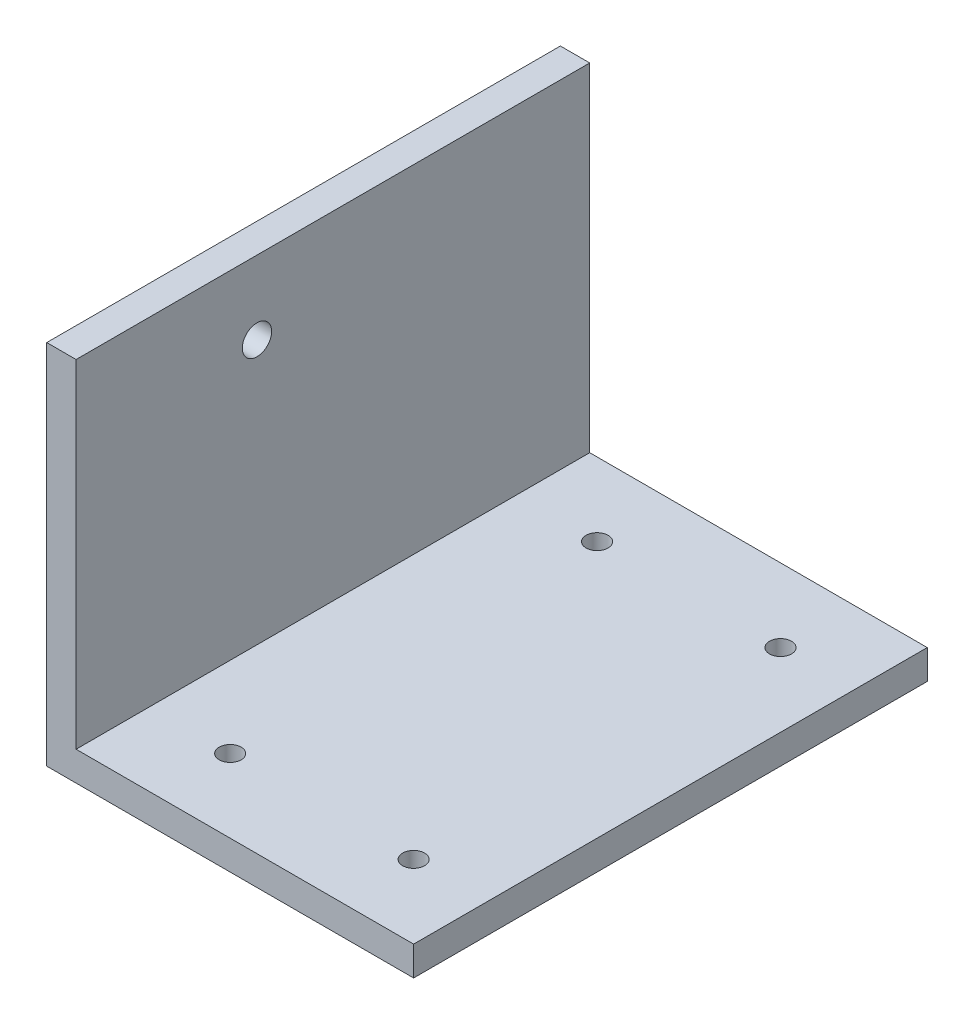
ISO-10303-21;
HEADER;
FILE_DESCRIPTION(('STEP AP214'),'2;1');
FILE_NAME('part.step','',(''),(''),'','','');
FILE_SCHEMA(('AUTOMOTIVE_DESIGN { 1 0 10303 214 1 1 1 1 }'));
ENDSEC;
DATA;
#1=APPLICATION_CONTEXT('core data for automotive mechanical design processes');
#2=APPLICATION_PROTOCOL_DEFINITION('international standard','automotive_design',2000,#1);
#3=PRODUCT_CONTEXT('',#1,'mechanical');
#4=PRODUCT('Part','Part','',(#3));
#5=PRODUCT_RELATED_PRODUCT_CATEGORY('part','',(#4));
#6=PRODUCT_DEFINITION_FORMATION('','',#4);
#7=PRODUCT_DEFINITION_CONTEXT('part definition',#1,'design');
#8=PRODUCT_DEFINITION('design','',#6,#7);
#9=PRODUCT_DEFINITION_SHAPE('','',#8);
#10=(LENGTH_UNIT() NAMED_UNIT(*) SI_UNIT(.MILLI.,.METRE.));
#11=(NAMED_UNIT(*) PLANE_ANGLE_UNIT() SI_UNIT($,.RADIAN.));
#12=(NAMED_UNIT(*) SI_UNIT($,.STERADIAN.) SOLID_ANGLE_UNIT());
#13=UNCERTAINTY_MEASURE_WITH_UNIT(LENGTH_MEASURE(1.E-05),#10,'distance_accuracy_value','');
#14=(GEOMETRIC_REPRESENTATION_CONTEXT(3) GLOBAL_UNCERTAINTY_ASSIGNED_CONTEXT((#13)) GLOBAL_UNIT_ASSIGNED_CONTEXT((#10,
#11,#12)) REPRESENTATION_CONTEXT('',''));
#15=CARTESIAN_POINT('',(0.,0.,0.));
#16=DIRECTION('',(0.,0.,1.));
#17=DIRECTION('',(1.,0.,0.));
#18=AXIS2_PLACEMENT_3D('',#15,#16,#17);
#19=CARTESIAN_POINT('',(0.,0.,70.));
#20=DIRECTION('',(1.,0.,0.));
#21=DIRECTION('',(0.,0.,-1.));
#22=AXIS2_PLACEMENT_3D('',#19,#20,#21);
#23=PLANE('',#22);
#24=CARTESIAN_POINT('',(0.,39.9999999999999,45.3500000000001));
#25=DIRECTION('',(-1.,0.,0.));
#26=DIRECTION('',(0.,0.,1.));
#27=AXIS2_PLACEMENT_3D('',#24,#25,#26);
#28=CIRCLE('',#27,2.00000000000001);
#29=CARTESIAN_POINT('',(0.,39.9999999999999,47.3500000000001));
#30=VERTEX_POINT('',#29);
#31=EDGE_CURVE('E274',#30,#30,#28,.T.);
#32=ORIENTED_EDGE('',*,*,#31,.F.);
#33=EDGE_LOOP('',(#32));
#34=FACE_BOUND('',#33,.T.);
#35=DIRECTION('',(0.,-1.,0.));
#36=VECTOR('',#35,1.);
#37=CARTESIAN_POINT('',(0.,0.,0.));
#38=LINE('',#37,#36);
#39=CARTESIAN_POINT('',(0.,50.,0.));
#40=VERTEX_POINT('',#39);
#41=CARTESIAN_POINT('',(0.,0.,0.));
#42=VERTEX_POINT('',#41);
#43=EDGE_CURVE('E118',#40,#42,#38,.T.);
#44=ORIENTED_EDGE('',*,*,#43,.T.);
#45=DIRECTION('',(0.,0.,-1.));
#46=VECTOR('',#45,1.);
#47=CARTESIAN_POINT('',(0.,0.,70.));
#48=LINE('',#47,#46);
#49=CARTESIAN_POINT('',(0.,0.,70.));
#50=VERTEX_POINT('',#49);
#51=EDGE_CURVE('E136',#50,#42,#48,.T.);
#52=ORIENTED_EDGE('',*,*,#51,.F.);
#53=DIRECTION('',(0.,-1.,0.));
#54=VECTOR('',#53,1.);
#55=CARTESIAN_POINT('',(0.,0.,70.));
#56=LINE('',#55,#54);
#57=CARTESIAN_POINT('',(0.,50.,70.));
#58=VERTEX_POINT('',#57);
#59=EDGE_CURVE('E129',#58,#50,#56,.T.);
#60=ORIENTED_EDGE('',*,*,#59,.F.);
#61=DIRECTION('',(0.,0.,-1.));
#62=VECTOR('',#61,1.);
#63=CARTESIAN_POINT('',(0.,50.,70.));
#64=LINE('',#63,#62);
#65=EDGE_CURVE('E114',#58,#40,#64,.T.);
#66=ORIENTED_EDGE('',*,*,#65,.T.);
#67=EDGE_LOOP('',(#44,#52,#60,#66));
#68=FACE_BOUND('',#67,.T.);
#69=ADVANCED_FACE('F30',(#34,#68),#23,.F.);
#70=CARTESIAN_POINT('',(4.,0.,70.));
#71=DIRECTION('',(0.,1.,0.));
#72=DIRECTION('',(0.,0.,1.));
#73=AXIS2_PLACEMENT_3D('',#70,#71,#72);
#74=PLANE('',#73);
#75=CARTESIAN_POINT('',(40.,0.,10.));
#76=DIRECTION('',(0.,1.,0.));
#77=DIRECTION('',(0.,0.,1.));
#78=AXIS2_PLACEMENT_3D('',#75,#76,#77);
#79=CIRCLE('',#78,1.5);
#80=CARTESIAN_POINT('',(40.,0.,11.5));
#81=VERTEX_POINT('',#80);
#82=EDGE_CURVE('E277',#81,#81,#79,.T.);
#83=ORIENTED_EDGE('',*,*,#82,.T.);
#84=EDGE_LOOP('',(#83));
#85=FACE_BOUND('',#84,.T.);
#86=CARTESIAN_POINT('',(40.,0.,60.));
#87=DIRECTION('',(0.,1.,0.));
#88=DIRECTION('',(0.,0.,1.));
#89=AXIS2_PLACEMENT_3D('',#86,#87,#88);
#90=CIRCLE('',#89,1.5);
#91=CARTESIAN_POINT('',(40.,0.,61.5));
#92=VERTEX_POINT('',#91);
#93=EDGE_CURVE('E122',#92,#92,#90,.T.);
#94=ORIENTED_EDGE('',*,*,#93,.T.);
#95=EDGE_LOOP('',(#94));
#96=FACE_BOUND('',#95,.T.);
#97=DIRECTION('',(1.,0.,0.));
#98=VECTOR('',#97,1.);
#99=CARTESIAN_POINT('',(4.,0.,0.));
#100=LINE('',#99,#98);
#101=CARTESIAN_POINT('',(50.,0.,0.));
#102=VERTEX_POINT('',#101);
#103=EDGE_CURVE('E121',#42,#102,#100,.T.);
#104=ORIENTED_EDGE('',*,*,#103,.T.);
#105=DIRECTION('',(0.,0.,-1.));
#106=VECTOR('',#105,1.);
#107=CARTESIAN_POINT('',(50.,0.,70.));
#108=LINE('',#107,#106);
#109=CARTESIAN_POINT('',(50.,0.,70.));
#110=VERTEX_POINT('',#109);
#111=EDGE_CURVE('E133',#110,#102,#108,.T.);
#112=ORIENTED_EDGE('',*,*,#111,.F.);
#113=DIRECTION('',(1.,0.,0.));
#114=VECTOR('',#113,1.);
#115=CARTESIAN_POINT('',(0.,0.,70.));
#116=LINE('',#115,#114);
#117=EDGE_CURVE('E86',#50,#110,#116,.T.);
#118=ORIENTED_EDGE('',*,*,#117,.F.);
#119=ORIENTED_EDGE('',*,*,#51,.T.);
#120=EDGE_LOOP('',(#104,#112,#118,#119));
#121=FACE_BOUND('',#120,.T.);
#122=CARTESIAN_POINT('',(15.,0.,60.));
#123=DIRECTION('',(0.,1.,0.));
#124=DIRECTION('',(0.,0.,1.));
#125=AXIS2_PLACEMENT_3D('',#122,#123,#124);
#126=CIRCLE('',#125,1.5);
#127=CARTESIAN_POINT('',(15.,0.,61.5));
#128=VERTEX_POINT('',#127);
#129=EDGE_CURVE('E138',#128,#128,#126,.T.);
#130=ORIENTED_EDGE('',*,*,#129,.T.);
#131=EDGE_LOOP('',(#130));
#132=FACE_BOUND('',#131,.T.);
#133=CARTESIAN_POINT('',(15.,0.,10.));
#134=DIRECTION('',(0.,1.,0.));
#135=DIRECTION('',(0.,0.,1.));
#136=AXIS2_PLACEMENT_3D('',#133,#134,#135);
#137=CIRCLE('',#136,1.5);
#138=CARTESIAN_POINT('',(15.,0.,11.5));
#139=VERTEX_POINT('',#138);
#140=EDGE_CURVE('E40',#139,#139,#137,.T.);
#141=ORIENTED_EDGE('',*,*,#140,.T.);
#142=EDGE_LOOP('',(#141));
#143=FACE_BOUND('',#142,.T.);
#144=ADVANCED_FACE('F147',(#85,#96,#121,#132,#143),#74,.F.);
#145=CARTESIAN_POINT('',(50.,0.,70.));
#146=DIRECTION('',(-1.,0.,0.));
#147=DIRECTION('',(0.,0.,1.));
#148=AXIS2_PLACEMENT_3D('',#145,#146,#147);
#149=PLANE('',#148);
#150=DIRECTION('',(0.,1.,0.));
#151=VECTOR('',#150,1.);
#152=CARTESIAN_POINT('',(50.,0.,0.));
#153=LINE('',#152,#151);
#154=CARTESIAN_POINT('',(50.,4.,0.));
#155=VERTEX_POINT('',#154);
#156=EDGE_CURVE('E124',#102,#155,#153,.T.);
#157=ORIENTED_EDGE('',*,*,#156,.T.);
#158=DIRECTION('',(0.,0.,-1.));
#159=VECTOR('',#158,1.);
#160=CARTESIAN_POINT('',(50.,4.,70.));
#161=LINE('',#160,#159);
#162=CARTESIAN_POINT('',(50.,4.,70.));
#163=VERTEX_POINT('',#162);
#164=EDGE_CURVE('E109',#163,#155,#161,.T.);
#165=ORIENTED_EDGE('',*,*,#164,.F.);
#166=DIRECTION('',(0.,1.,0.));
#167=VECTOR('',#166,1.);
#168=CARTESIAN_POINT('',(50.,0.,70.));
#169=LINE('',#168,#167);
#170=EDGE_CURVE('E99',#110,#163,#169,.T.);
#171=ORIENTED_EDGE('',*,*,#170,.F.);
#172=ORIENTED_EDGE('',*,*,#111,.T.);
#173=EDGE_LOOP('',(#157,#165,#171,#172));
#174=FACE_BOUND('',#173,.T.);
#175=ADVANCED_FACE('F156',(#174),#149,.F.);
#176=CARTESIAN_POINT('',(4.,4.,70.));
#177=DIRECTION('',(0.,-1.,0.));
#178=DIRECTION('',(0.,0.,-1.));
#179=AXIS2_PLACEMENT_3D('',#176,#177,#178);
#180=PLANE('',#179);
#181=CARTESIAN_POINT('',(40.,4.,10.));
#182=DIRECTION('',(0.,1.,0.));
#183=DIRECTION('',(0.,0.,1.));
#184=AXIS2_PLACEMENT_3D('',#181,#182,#183);
#185=CIRCLE('',#184,1.5);
#186=CARTESIAN_POINT('',(40.,4.,11.5));
#187=VERTEX_POINT('',#186);
#188=EDGE_CURVE('E279',#187,#187,#185,.T.);
#189=ORIENTED_EDGE('',*,*,#188,.F.);
#190=EDGE_LOOP('',(#189));
#191=FACE_BOUND('',#190,.T.);
#192=CARTESIAN_POINT('',(40.,4.,60.));
#193=DIRECTION('',(0.,1.,0.));
#194=DIRECTION('',(0.,0.,1.));
#195=AXIS2_PLACEMENT_3D('',#192,#193,#194);
#196=CIRCLE('',#195,1.5);
#197=CARTESIAN_POINT('',(40.,4.,61.5));
#198=VERTEX_POINT('',#197);
#199=EDGE_CURVE('E285',#198,#198,#196,.T.);
#200=ORIENTED_EDGE('',*,*,#199,.F.);
#201=EDGE_LOOP('',(#200));
#202=FACE_BOUND('',#201,.T.);
#203=DIRECTION('',(-1.,0.,0.));
#204=VECTOR('',#203,1.);
#205=CARTESIAN_POINT('',(4.,4.,0.));
#206=LINE('',#205,#204);
#207=CARTESIAN_POINT('',(4.,4.,0.));
#208=VERTEX_POINT('',#207);
#209=EDGE_CURVE('E108',#155,#208,#206,.T.);
#210=ORIENTED_EDGE('',*,*,#209,.T.);
#211=DIRECTION('',(0.,0.,-1.));
#212=VECTOR('',#211,1.);
#213=CARTESIAN_POINT('',(4.,4.,70.));
#214=LINE('',#213,#212);
#215=CARTESIAN_POINT('',(4.,4.,70.));
#216=VERTEX_POINT('',#215);
#217=EDGE_CURVE('E104',#216,#208,#214,.T.);
#218=ORIENTED_EDGE('',*,*,#217,.F.);
#219=DIRECTION('',(-1.,0.,0.));
#220=VECTOR('',#219,1.);
#221=CARTESIAN_POINT('',(4.,4.,70.));
#222=LINE('',#221,#220);
#223=EDGE_CURVE('E93',#163,#216,#222,.T.);
#224=ORIENTED_EDGE('',*,*,#223,.F.);
#225=ORIENTED_EDGE('',*,*,#164,.T.);
#226=EDGE_LOOP('',(#210,#218,#224,#225));
#227=FACE_BOUND('',#226,.T.);
#228=CARTESIAN_POINT('',(15.,4.,60.));
#229=DIRECTION('',(0.,1.,0.));
#230=DIRECTION('',(0.,0.,1.));
#231=AXIS2_PLACEMENT_3D('',#228,#229,#230);
#232=CIRCLE('',#231,1.5);
#233=CARTESIAN_POINT('',(15.,4.,61.5));
#234=VERTEX_POINT('',#233);
#235=EDGE_CURVE('E141',#234,#234,#232,.T.);
#236=ORIENTED_EDGE('',*,*,#235,.F.);
#237=EDGE_LOOP('',(#236));
#238=FACE_BOUND('',#237,.T.);
#239=CARTESIAN_POINT('',(15.,4.,10.));
#240=DIRECTION('',(0.,1.,0.));
#241=DIRECTION('',(0.,0.,1.));
#242=AXIS2_PLACEMENT_3D('',#239,#240,#241);
#243=CIRCLE('',#242,1.5);
#244=CARTESIAN_POINT('',(15.,4.,11.5));
#245=VERTEX_POINT('',#244);
#246=EDGE_CURVE('E11',#245,#245,#243,.T.);
#247=ORIENTED_EDGE('',*,*,#246,.F.);
#248=EDGE_LOOP('',(#247));
#249=FACE_BOUND('',#248,.T.);
#250=ADVANCED_FACE('F105',(#191,#202,#227,#238,#249),#180,.F.);
#251=CARTESIAN_POINT('',(4.,4.,70.));
#252=DIRECTION('',(-1.,0.,0.));
#253=DIRECTION('',(0.,0.,1.));
#254=AXIS2_PLACEMENT_3D('',#251,#252,#253);
#255=PLANE('',#254);
#256=CARTESIAN_POINT('',(4.,39.9999999999999,45.3500000000001));
#257=DIRECTION('',(-1.,0.,0.));
#258=DIRECTION('',(0.,0.,1.));
#259=AXIS2_PLACEMENT_3D('',#256,#257,#258);
#260=CIRCLE('',#259,2.00000000000001);
#261=CARTESIAN_POINT('',(4.,39.9999999999999,47.3500000000001));
#262=VERTEX_POINT('',#261);
#263=EDGE_CURVE('E34',#262,#262,#260,.T.);
#264=ORIENTED_EDGE('',*,*,#263,.T.);
#265=EDGE_LOOP('',(#264));
#266=FACE_BOUND('',#265,.T.);
#267=DIRECTION('',(0.,1.,0.));
#268=VECTOR('',#267,1.);
#269=CARTESIAN_POINT('',(4.,4.,0.));
#270=LINE('',#269,#268);
#271=CARTESIAN_POINT('',(4.,50.,0.));
#272=VERTEX_POINT('',#271);
#273=EDGE_CURVE('E71',#208,#272,#270,.T.);
#274=ORIENTED_EDGE('',*,*,#273,.T.);
#275=DIRECTION('',(0.,0.,-1.));
#276=VECTOR('',#275,1.);
#277=CARTESIAN_POINT('',(4.,50.,70.));
#278=LINE('',#277,#276);
#279=CARTESIAN_POINT('',(4.,50.,70.));
#280=VERTEX_POINT('',#279);
#281=EDGE_CURVE('E110',#280,#272,#278,.T.);
#282=ORIENTED_EDGE('',*,*,#281,.F.);
#283=DIRECTION('',(0.,1.,0.));
#284=VECTOR('',#283,1.);
#285=CARTESIAN_POINT('',(4.,4.,70.));
#286=LINE('',#285,#284);
#287=EDGE_CURVE('E97',#216,#280,#286,.T.);
#288=ORIENTED_EDGE('',*,*,#287,.F.);
#289=ORIENTED_EDGE('',*,*,#217,.T.);
#290=EDGE_LOOP('',(#274,#282,#288,#289));
#291=FACE_BOUND('',#290,.T.);
#292=ADVANCED_FACE('F112',(#266,#291),#255,.F.);
#293=CARTESIAN_POINT('',(0.,50.,70.));
#294=DIRECTION('',(0.,-1.,0.));
#295=DIRECTION('',(0.,0.,-1.));
#296=AXIS2_PLACEMENT_3D('',#293,#294,#295);
#297=PLANE('',#296);
#298=DIRECTION('',(-1.,0.,0.));
#299=VECTOR('',#298,1.);
#300=CARTESIAN_POINT('',(0.,50.,0.));
#301=LINE('',#300,#299);
#302=EDGE_CURVE('E77',#272,#40,#301,.T.);
#303=ORIENTED_EDGE('',*,*,#302,.T.);
#304=ORIENTED_EDGE('',*,*,#65,.F.);
#305=DIRECTION('',(-1.,0.,0.));
#306=VECTOR('',#305,1.);
#307=CARTESIAN_POINT('',(0.,50.,70.));
#308=LINE('',#307,#306);
#309=EDGE_CURVE('E48',#280,#58,#308,.T.);
#310=ORIENTED_EDGE('',*,*,#309,.F.);
#311=ORIENTED_EDGE('',*,*,#281,.T.);
#312=EDGE_LOOP('',(#303,#304,#310,#311));
#313=FACE_BOUND('',#312,.T.);
#314=ADVANCED_FACE('F163',(#313),#297,.F.);
#315=CARTESIAN_POINT('',(0.,50.,70.));
#316=DIRECTION('',(0.,0.,-1.));
#317=DIRECTION('',(-1.,0.,0.));
#318=AXIS2_PLACEMENT_3D('',#315,#316,#317);
#319=PLANE('',#318);
#320=ORIENTED_EDGE('',*,*,#59,.T.);
#321=ORIENTED_EDGE('',*,*,#117,.T.);
#322=ORIENTED_EDGE('',*,*,#170,.T.);
#323=ORIENTED_EDGE('',*,*,#223,.T.);
#324=ORIENTED_EDGE('',*,*,#287,.T.);
#325=ORIENTED_EDGE('',*,*,#309,.T.);
#326=EDGE_LOOP('',(#320,#321,#322,#323,#324,#325));
#327=FACE_BOUND('',#326,.T.);
#328=ADVANCED_FACE('F95',(#327),#319,.F.);
#329=CARTESIAN_POINT('',(0.,50.,0.));
#330=DIRECTION('',(0.,0.,-1.));
#331=DIRECTION('',(-1.,0.,0.));
#332=AXIS2_PLACEMENT_3D('',#329,#330,#331);
#333=PLANE('',#332);
#334=ORIENTED_EDGE('',*,*,#43,.F.);
#335=ORIENTED_EDGE('',*,*,#302,.F.);
#336=ORIENTED_EDGE('',*,*,#273,.F.);
#337=ORIENTED_EDGE('',*,*,#209,.F.);
#338=ORIENTED_EDGE('',*,*,#156,.F.);
#339=ORIENTED_EDGE('',*,*,#103,.F.);
#340=EDGE_LOOP('',(#334,#335,#336,#337,#338,#339));
#341=FACE_BOUND('',#340,.T.);
#342=ADVANCED_FACE('F196',(#341),#333,.T.);
#343=CARTESIAN_POINT('',(40.,0.,60.));
#344=DIRECTION('',(0.,1.,0.));
#345=DIRECTION('',(0.,0.,1.));
#346=AXIS2_PLACEMENT_3D('',#343,#344,#345);
#347=CYLINDRICAL_SURFACE('',#346,1.5);
#348=ORIENTED_EDGE('',*,*,#93,.F.);
#349=EDGE_LOOP('',(#348));
#350=FACE_BOUND('',#349,.T.);
#351=ORIENTED_EDGE('',*,*,#199,.T.);
#352=EDGE_LOOP('',(#351));
#353=FACE_BOUND('',#352,.T.);
#354=ADVANCED_FACE('F186',(#350,#353),#347,.F.);
#355=CARTESIAN_POINT('',(40.,0.,10.));
#356=DIRECTION('',(0.,1.,0.));
#357=DIRECTION('',(0.,0.,1.));
#358=AXIS2_PLACEMENT_3D('',#355,#356,#357);
#359=CYLINDRICAL_SURFACE('',#358,1.5);
#360=ORIENTED_EDGE('',*,*,#82,.F.);
#361=EDGE_LOOP('',(#360));
#362=FACE_BOUND('',#361,.T.);
#363=ORIENTED_EDGE('',*,*,#188,.T.);
#364=EDGE_LOOP('',(#363));
#365=FACE_BOUND('',#364,.T.);
#366=ADVANCED_FACE('F181',(#362,#365),#359,.F.);
#367=CARTESIAN_POINT('',(15.,0.,60.));
#368=DIRECTION('',(0.,1.,0.));
#369=DIRECTION('',(0.,0.,1.));
#370=AXIS2_PLACEMENT_3D('',#367,#368,#369);
#371=CYLINDRICAL_SURFACE('',#370,1.5);
#372=ORIENTED_EDGE('',*,*,#129,.F.);
#373=EDGE_LOOP('',(#372));
#374=FACE_BOUND('',#373,.T.);
#375=ORIENTED_EDGE('',*,*,#235,.T.);
#376=EDGE_LOOP('',(#375));
#377=FACE_BOUND('',#376,.T.);
#378=ADVANCED_FACE('F152',(#374,#377),#371,.F.);
#379=CARTESIAN_POINT('',(15.,0.,10.));
#380=DIRECTION('',(0.,1.,0.));
#381=DIRECTION('',(0.,0.,1.));
#382=AXIS2_PLACEMENT_3D('',#379,#380,#381);
#383=CYLINDRICAL_SURFACE('',#382,1.5);
#384=ORIENTED_EDGE('',*,*,#140,.F.);
#385=EDGE_LOOP('',(#384));
#386=FACE_BOUND('',#385,.T.);
#387=ORIENTED_EDGE('',*,*,#246,.T.);
#388=EDGE_LOOP('',(#387));
#389=FACE_BOUND('',#388,.T.);
#390=ADVANCED_FACE('F32',(#386,#389),#383,.F.);
#391=CARTESIAN_POINT('',(50.,39.9999999999999,45.3500000000001));
#392=DIRECTION('',(-1.,0.,0.));
#393=DIRECTION('',(0.,0.,1.));
#394=AXIS2_PLACEMENT_3D('',#391,#392,#393);
#395=CYLINDRICAL_SURFACE('',#394,2.00000000000001);
#396=ORIENTED_EDGE('',*,*,#31,.T.);
#397=EDGE_LOOP('',(#396));
#398=FACE_BOUND('',#397,.T.);
#399=ORIENTED_EDGE('',*,*,#263,.F.);
#400=EDGE_LOOP('',(#399));
#401=FACE_BOUND('',#400,.T.);
#402=ADVANCED_FACE('F151',(#398,#401),#395,.F.);
#403=CLOSED_SHELL('',(#69,#144,#175,#250,#292,#314,#328,#342,#354,#366,#378,#390,#402));
#404=MANIFOLD_SOLID_BREP('B2',#403);
#405=ADVANCED_BREP_SHAPE_REPRESENTATION('',(#18,#404),#14);
#406=SHAPE_DEFINITION_REPRESENTATION(#9,#405);
ENDSEC;
END-ISO-10303-21;
